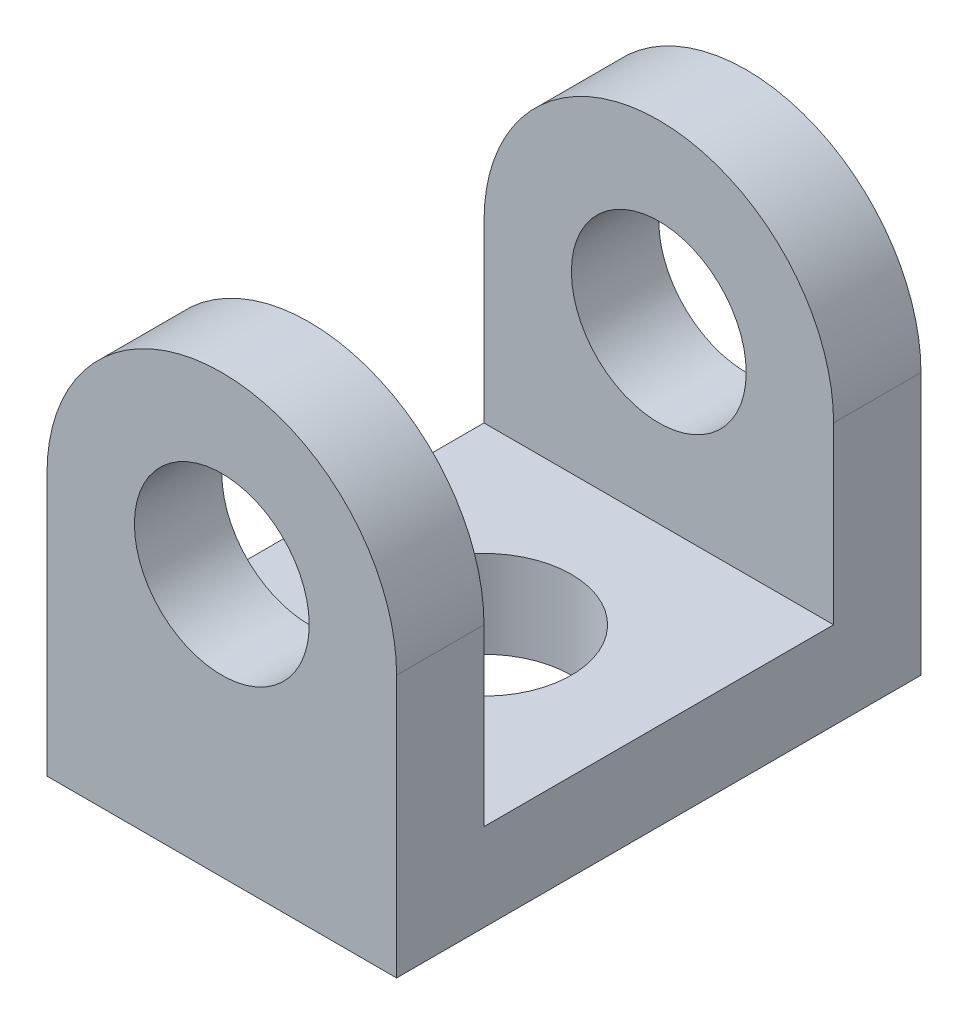
ISO-10303-21;
HEADER;
FILE_DESCRIPTION(('STEP AP214'),'2;1');
FILE_NAME('part.step','',(''),(''),'','','');
FILE_SCHEMA(('AUTOMOTIVE_DESIGN { 1 0 10303 214 1 1 1 1 }'));
ENDSEC;
DATA;
#1=APPLICATION_CONTEXT('core data for automotive mechanical design processes');
#2=APPLICATION_PROTOCOL_DEFINITION('international standard','automotive_design',2000,#1);
#3=PRODUCT_CONTEXT('',#1,'mechanical');
#4=PRODUCT('Part','Part','',(#3));
#5=PRODUCT_RELATED_PRODUCT_CATEGORY('part','',(#4));
#6=PRODUCT_DEFINITION_FORMATION('','',#4);
#7=PRODUCT_DEFINITION_CONTEXT('part definition',#1,'design');
#8=PRODUCT_DEFINITION('design','',#6,#7);
#9=PRODUCT_DEFINITION_SHAPE('','',#8);
#10=(LENGTH_UNIT() NAMED_UNIT(*) SI_UNIT(.MILLI.,.METRE.));
#11=(NAMED_UNIT(*) PLANE_ANGLE_UNIT() SI_UNIT($,.RADIAN.));
#12=(NAMED_UNIT(*) SI_UNIT($,.STERADIAN.) SOLID_ANGLE_UNIT());
#13=UNCERTAINTY_MEASURE_WITH_UNIT(LENGTH_MEASURE(1.E-05),#10,'distance_accuracy_value','');
#14=(GEOMETRIC_REPRESENTATION_CONTEXT(3) GLOBAL_UNCERTAINTY_ASSIGNED_CONTEXT((#13)) GLOBAL_UNIT_ASSIGNED_CONTEXT((#10,
#11,#12)) REPRESENTATION_CONTEXT('',''));
#15=CARTESIAN_POINT('',(0.,0.,0.));
#16=DIRECTION('',(0.,0.,1.));
#17=DIRECTION('',(1.,0.,0.));
#18=AXIS2_PLACEMENT_3D('',#15,#16,#17);
#19=CARTESIAN_POINT('',(0.,10.,30.));
#20=DIRECTION('',(0.,1.,0.));
#21=DIRECTION('',(0.,0.,1.));
#22=AXIS2_PLACEMENT_3D('',#19,#20,#21);
#23=PLANE('',#22);
#24=DIRECTION('',(1.,0.,0.));
#25=VECTOR('',#24,1.);
#26=CARTESIAN_POINT('',(0.,10.,50.));
#27=LINE('',#26,#25);
#28=CARTESIAN_POINT('',(0.,10.,50.));
#29=VERTEX_POINT('',#28);
#30=CARTESIAN_POINT('',(40.,10.,50.));
#31=VERTEX_POINT('',#30);
#32=EDGE_CURVE('E53',#29,#31,#27,.T.);
#33=ORIENTED_EDGE('',*,*,#32,.T.);
#34=DIRECTION('',(0.,0.,-1.));
#35=VECTOR('',#34,1.);
#36=CARTESIAN_POINT('',(40.,10.,30.));
#37=LINE('',#36,#35);
#38=CARTESIAN_POINT('',(40.,10.,10.));
#39=VERTEX_POINT('',#38);
#40=EDGE_CURVE('E161',#31,#39,#37,.T.);
#41=ORIENTED_EDGE('',*,*,#40,.T.);
#42=DIRECTION('',(1.,0.,0.));
#43=VECTOR('',#42,1.);
#44=CARTESIAN_POINT('',(0.,10.,10.));
#45=LINE('',#44,#43);
#46=CARTESIAN_POINT('',(0.,10.,9.99999999999999));
#47=VERTEX_POINT('',#46);
#48=EDGE_CURVE('E148',#47,#39,#45,.T.);
#49=ORIENTED_EDGE('',*,*,#48,.F.);
#50=DIRECTION('',(0.,0.,-1.));
#51=VECTOR('',#50,1.);
#52=CARTESIAN_POINT('',(0.,10.,30.));
#53=LINE('',#52,#51);
#54=EDGE_CURVE('E11',#29,#47,#53,.T.);
#55=ORIENTED_EDGE('',*,*,#54,.F.);
#56=EDGE_LOOP('',(#33,#41,#49,#55));
#57=FACE_BOUND('',#56,.T.);
#58=CARTESIAN_POINT('',(20.,10.,30.));
#59=DIRECTION('',(0.,1.,0.));
#60=DIRECTION('',(0.,0.,1.));
#61=AXIS2_PLACEMENT_3D('',#58,#59,#60);
#62=CIRCLE('',#61,10.);
#63=CARTESIAN_POINT('',(20.,10.,40.));
#64=VERTEX_POINT('',#63);
#65=EDGE_CURVE('E127',#64,#64,#62,.T.);
#66=ORIENTED_EDGE('',*,*,#65,.F.);
#67=EDGE_LOOP('',(#66));
#68=FACE_BOUND('',#67,.T.);
#69=ADVANCED_FACE('F35',(#57,#68),#23,.T.);
#70=CARTESIAN_POINT('',(0.,0.,30.));
#71=DIRECTION('',(0.,1.,0.));
#72=DIRECTION('',(0.,0.,1.));
#73=AXIS2_PLACEMENT_3D('',#70,#71,#72);
#74=PLANE('',#73);
#75=DIRECTION('',(1.,0.,0.));
#76=VECTOR('',#75,1.);
#77=CARTESIAN_POINT('',(0.,0.,0.));
#78=LINE('',#77,#76);
#79=CARTESIAN_POINT('',(0.,0.,0.));
#80=VERTEX_POINT('',#79);
#81=CARTESIAN_POINT('',(40.,0.,0.));
#82=VERTEX_POINT('',#81);
#83=EDGE_CURVE('E175',#80,#82,#78,.T.);
#84=ORIENTED_EDGE('',*,*,#83,.T.);
#85=DIRECTION('',(0.,0.,-1.));
#86=VECTOR('',#85,1.);
#87=CARTESIAN_POINT('',(40.,0.,30.));
#88=LINE('',#87,#86);
#89=CARTESIAN_POINT('',(40.,0.,60.));
#90=VERTEX_POINT('',#89);
#91=EDGE_CURVE('E163',#90,#82,#88,.T.);
#92=ORIENTED_EDGE('',*,*,#91,.F.);
#93=DIRECTION('',(1.,0.,0.));
#94=VECTOR('',#93,1.);
#95=CARTESIAN_POINT('',(0.,0.,60.));
#96=LINE('',#95,#94);
#97=CARTESIAN_POINT('',(0.,0.,60.));
#98=VERTEX_POINT('',#97);
#99=EDGE_CURVE('E131',#98,#90,#96,.T.);
#100=ORIENTED_EDGE('',*,*,#99,.F.);
#101=DIRECTION('',(0.,0.,-1.));
#102=VECTOR('',#101,1.);
#103=CARTESIAN_POINT('',(0.,0.,30.));
#104=LINE('',#103,#102);
#105=EDGE_CURVE('E43',#98,#80,#104,.T.);
#106=ORIENTED_EDGE('',*,*,#105,.T.);
#107=EDGE_LOOP('',(#84,#92,#100,#106));
#108=FACE_BOUND('',#107,.T.);
#109=CARTESIAN_POINT('',(20.,0.,30.));
#110=DIRECTION('',(0.,1.,0.));
#111=DIRECTION('',(0.,0.,1.));
#112=AXIS2_PLACEMENT_3D('',#109,#110,#111);
#113=CIRCLE('',#112,10.);
#114=CARTESIAN_POINT('',(20.,0.,40.));
#115=VERTEX_POINT('',#114);
#116=EDGE_CURVE('E218',#115,#115,#113,.T.);
#117=ORIENTED_EDGE('',*,*,#116,.T.);
#118=EDGE_LOOP('',(#117));
#119=FACE_BOUND('',#118,.T.);
#120=ADVANCED_FACE('F173',(#108,#119),#74,.F.);
#121=CARTESIAN_POINT('',(0.,0.,30.));
#122=DIRECTION('',(-1.,0.,0.));
#123=DIRECTION('',(0.,0.,1.));
#124=AXIS2_PLACEMENT_3D('',#121,#122,#123);
#125=PLANE('',#124);
#126=DIRECTION('',(0.,1.,0.));
#127=VECTOR('',#126,1.);
#128=CARTESIAN_POINT('',(0.,0.,0.));
#129=LINE('',#128,#127);
#130=CARTESIAN_POINT('',(0.,30.,0.));
#131=VERTEX_POINT('',#130);
#132=EDGE_CURVE('E181',#80,#131,#129,.T.);
#133=ORIENTED_EDGE('',*,*,#132,.F.);
#134=ORIENTED_EDGE('',*,*,#105,.F.);
#135=DIRECTION('',(0.,1.,0.));
#136=VECTOR('',#135,1.);
#137=CARTESIAN_POINT('',(0.,0.,60.));
#138=LINE('',#137,#136);
#139=CARTESIAN_POINT('',(0.,30.,60.));
#140=VERTEX_POINT('',#139);
#141=EDGE_CURVE('E109',#98,#140,#138,.T.);
#142=ORIENTED_EDGE('',*,*,#141,.T.);
#143=DIRECTION('',(0.,0.,1.));
#144=VECTOR('',#143,1.);
#145=CARTESIAN_POINT('',(0.,30.,50.));
#146=LINE('',#145,#144);
#147=CARTESIAN_POINT('',(0.,30.,50.));
#148=VERTEX_POINT('',#147);
#149=EDGE_CURVE('E105',#148,#140,#146,.T.);
#150=ORIENTED_EDGE('',*,*,#149,.F.);
#151=DIRECTION('',(0.,1.,0.));
#152=VECTOR('',#151,1.);
#153=CARTESIAN_POINT('',(0.,0.,50.));
#154=LINE('',#153,#152);
#155=EDGE_CURVE('E96',#29,#148,#154,.T.);
#156=ORIENTED_EDGE('',*,*,#155,.F.);
#157=ORIENTED_EDGE('',*,*,#54,.T.);
#158=DIRECTION('',(0.,1.,0.));
#159=VECTOR('',#158,1.);
#160=CARTESIAN_POINT('',(0.,0.,10.));
#161=LINE('',#160,#159);
#162=CARTESIAN_POINT('',(0.,30.,10.));
#163=VERTEX_POINT('',#162);
#164=EDGE_CURVE('E143',#47,#163,#161,.T.);
#165=ORIENTED_EDGE('',*,*,#164,.T.);
#166=DIRECTION('',(0.,0.,-1.));
#167=VECTOR('',#166,1.);
#168=CARTESIAN_POINT('',(0.,30.,10.));
#169=LINE('',#168,#167);
#170=EDGE_CURVE('E151',#163,#131,#169,.T.);
#171=ORIENTED_EDGE('',*,*,#170,.T.);
#172=EDGE_LOOP('',(#133,#134,#142,#150,#156,#157,#165,#171));
#173=FACE_BOUND('',#172,.T.);
#174=ADVANCED_FACE('F107',(#173),#125,.T.);
#175=CARTESIAN_POINT('',(40.,0.,30.));
#176=DIRECTION('',(-1.,0.,0.));
#177=DIRECTION('',(0.,0.,1.));
#178=AXIS2_PLACEMENT_3D('',#175,#176,#177);
#179=PLANE('',#178);
#180=DIRECTION('',(0.,1.,0.));
#181=VECTOR('',#180,1.);
#182=CARTESIAN_POINT('',(40.,0.,0.));
#183=LINE('',#182,#181);
#184=CARTESIAN_POINT('',(40.,30.,0.));
#185=VERTEX_POINT('',#184);
#186=EDGE_CURVE('E164',#82,#185,#183,.T.);
#187=ORIENTED_EDGE('',*,*,#186,.T.);
#188=DIRECTION('',(0.,0.,-1.));
#189=VECTOR('',#188,1.);
#190=CARTESIAN_POINT('',(40.,30.,10.));
#191=LINE('',#190,#189);
#192=CARTESIAN_POINT('',(40.,30.,10.));
#193=VERTEX_POINT('',#192);
#194=EDGE_CURVE('E185',#193,#185,#191,.T.);
#195=ORIENTED_EDGE('',*,*,#194,.F.);
#196=DIRECTION('',(0.,1.,0.));
#197=VECTOR('',#196,1.);
#198=CARTESIAN_POINT('',(40.,0.,10.));
#199=LINE('',#198,#197);
#200=EDGE_CURVE('E139',#39,#193,#199,.T.);
#201=ORIENTED_EDGE('',*,*,#200,.F.);
#202=ORIENTED_EDGE('',*,*,#40,.F.);
#203=DIRECTION('',(0.,1.,0.));
#204=VECTOR('',#203,1.);
#205=CARTESIAN_POINT('',(40.,0.,50.));
#206=LINE('',#205,#204);
#207=CARTESIAN_POINT('',(40.,30.,50.));
#208=VERTEX_POINT('',#207);
#209=EDGE_CURVE('E225',#31,#208,#206,.T.);
#210=ORIENTED_EDGE('',*,*,#209,.T.);
#211=DIRECTION('',(0.,0.,1.));
#212=VECTOR('',#211,1.);
#213=CARTESIAN_POINT('',(40.,30.,50.));
#214=LINE('',#213,#212);
#215=CARTESIAN_POINT('',(40.,30.,60.));
#216=VERTEX_POINT('',#215);
#217=EDGE_CURVE('E114',#208,#216,#214,.T.);
#218=ORIENTED_EDGE('',*,*,#217,.T.);
#219=DIRECTION('',(0.,1.,0.));
#220=VECTOR('',#219,1.);
#221=CARTESIAN_POINT('',(40.,0.,60.));
#222=LINE('',#221,#220);
#223=EDGE_CURVE('E113',#90,#216,#222,.T.);
#224=ORIENTED_EDGE('',*,*,#223,.F.);
#225=ORIENTED_EDGE('',*,*,#91,.T.);
#226=EDGE_LOOP('',(#187,#195,#201,#202,#210,#218,#224,#225));
#227=FACE_BOUND('',#226,.T.);
#228=ADVANCED_FACE('F227',(#227),#179,.F.);
#229=CARTESIAN_POINT('',(0.,0.,0.));
#230=DIRECTION('',(0.,0.,1.));
#231=DIRECTION('',(1.,0.,0.));
#232=AXIS2_PLACEMENT_3D('',#229,#230,#231);
#233=PLANE('',#232);
#234=ORIENTED_EDGE('',*,*,#132,.T.);
#235=CARTESIAN_POINT('',(20.,30.,0.));
#236=DIRECTION('',(0.,0.,1.));
#237=DIRECTION('',(1.,0.,0.));
#238=AXIS2_PLACEMENT_3D('',#235,#236,#237);
#239=CIRCLE('',#238,20.);
#240=EDGE_CURVE('E140',#185,#131,#239,.T.);
#241=ORIENTED_EDGE('',*,*,#240,.F.);
#242=ORIENTED_EDGE('',*,*,#186,.F.);
#243=ORIENTED_EDGE('',*,*,#83,.F.);
#244=EDGE_LOOP('',(#234,#241,#242,#243));
#245=FACE_BOUND('',#244,.T.);
#246=CARTESIAN_POINT('',(20.,30.,0.));
#247=DIRECTION('',(0.,0.,1.));
#248=DIRECTION('',(1.,0.,0.));
#249=AXIS2_PLACEMENT_3D('',#246,#247,#248);
#250=CIRCLE('',#249,10.);
#251=CARTESIAN_POINT('',(30.,30.,0.));
#252=VERTEX_POINT('',#251);
#253=EDGE_CURVE('E135',#252,#252,#250,.T.);
#254=ORIENTED_EDGE('',*,*,#253,.T.);
#255=EDGE_LOOP('',(#254));
#256=FACE_BOUND('',#255,.T.);
#257=ADVANCED_FACE('F178',(#245,#256),#233,.F.);
#258=CARTESIAN_POINT('',(20.,30.,10.));
#259=DIRECTION('',(0.,0.,-1.));
#260=DIRECTION('',(-1.,0.,0.));
#261=AXIS2_PLACEMENT_3D('',#258,#259,#260);
#262=CYLINDRICAL_SURFACE('',#261,20.);
#263=ORIENTED_EDGE('',*,*,#240,.T.);
#264=ORIENTED_EDGE('',*,*,#170,.F.);
#265=CARTESIAN_POINT('',(20.,30.,10.));
#266=DIRECTION('',(0.,0.,1.));
#267=DIRECTION('',(1.,0.,0.));
#268=AXIS2_PLACEMENT_3D('',#265,#266,#267);
#269=CIRCLE('',#268,20.);
#270=EDGE_CURVE('E141',#193,#163,#269,.T.);
#271=ORIENTED_EDGE('',*,*,#270,.F.);
#272=ORIENTED_EDGE('',*,*,#194,.T.);
#273=EDGE_LOOP('',(#263,#264,#271,#272));
#274=FACE_BOUND('',#273,.T.);
#275=ADVANCED_FACE('F197',(#274),#262,.T.);
#276=CARTESIAN_POINT('',(20.,30.,10.));
#277=DIRECTION('',(0.,0.,-1.));
#278=DIRECTION('',(-1.,0.,0.));
#279=AXIS2_PLACEMENT_3D('',#276,#277,#278);
#280=CYLINDRICAL_SURFACE('',#279,10.);
#281=CARTESIAN_POINT('',(20.,30.,10.));
#282=DIRECTION('',(0.,0.,1.));
#283=DIRECTION('',(1.,0.,0.));
#284=AXIS2_PLACEMENT_3D('',#281,#282,#283);
#285=CIRCLE('',#284,10.);
#286=CARTESIAN_POINT('',(30.,30.,10.));
#287=VERTEX_POINT('',#286);
#288=EDGE_CURVE('E136',#287,#287,#285,.T.);
#289=ORIENTED_EDGE('',*,*,#288,.T.);
#290=EDGE_LOOP('',(#289));
#291=FACE_BOUND('',#290,.T.);
#292=ORIENTED_EDGE('',*,*,#253,.F.);
#293=EDGE_LOOP('',(#292));
#294=FACE_BOUND('',#293,.T.);
#295=ADVANCED_FACE('F194',(#291,#294),#280,.F.);
#296=CARTESIAN_POINT('',(0.,0.,10.));
#297=DIRECTION('',(0.,0.,1.));
#298=DIRECTION('',(1.,0.,0.));
#299=AXIS2_PLACEMENT_3D('',#296,#297,#298);
#300=PLANE('',#299);
#301=ORIENTED_EDGE('',*,*,#288,.F.);
#302=EDGE_LOOP('',(#301));
#303=FACE_BOUND('',#302,.T.);
#304=ORIENTED_EDGE('',*,*,#200,.T.);
#305=ORIENTED_EDGE('',*,*,#270,.T.);
#306=ORIENTED_EDGE('',*,*,#164,.F.);
#307=ORIENTED_EDGE('',*,*,#48,.T.);
#308=EDGE_LOOP('',(#304,#305,#306,#307));
#309=FACE_BOUND('',#308,.T.);
#310=ADVANCED_FACE('F196',(#303,#309),#300,.T.);
#311=CARTESIAN_POINT('',(0.,0.,60.));
#312=DIRECTION('',(0.,0.,-1.));
#313=DIRECTION('',(1.,0.,0.));
#314=AXIS2_PLACEMENT_3D('',#311,#312,#313);
#315=PLANE('',#314);
#316=ORIENTED_EDGE('',*,*,#223,.T.);
#317=CARTESIAN_POINT('',(20.,30.,60.));
#318=DIRECTION('',(0.,0.,1.));
#319=DIRECTION('',(1.,0.,0.));
#320=AXIS2_PLACEMENT_3D('',#317,#318,#319);
#321=CIRCLE('',#320,20.);
#322=EDGE_CURVE('E126',#216,#140,#321,.T.);
#323=ORIENTED_EDGE('',*,*,#322,.T.);
#324=ORIENTED_EDGE('',*,*,#141,.F.);
#325=ORIENTED_EDGE('',*,*,#99,.T.);
#326=EDGE_LOOP('',(#316,#323,#324,#325));
#327=FACE_BOUND('',#326,.T.);
#328=CARTESIAN_POINT('',(20.,30.,60.));
#329=DIRECTION('',(0.,0.,1.));
#330=DIRECTION('',(1.,0.,0.));
#331=AXIS2_PLACEMENT_3D('',#328,#329,#330);
#332=CIRCLE('',#331,10.);
#333=CARTESIAN_POINT('',(30.,30.,60.));
#334=VERTEX_POINT('',#333);
#335=EDGE_CURVE('E123',#334,#334,#332,.T.);
#336=ORIENTED_EDGE('',*,*,#335,.F.);
#337=EDGE_LOOP('',(#336));
#338=FACE_BOUND('',#337,.T.);
#339=ADVANCED_FACE('F204',(#327,#338),#315,.F.);
#340=CARTESIAN_POINT('',(20.,30.,50.));
#341=DIRECTION('',(0.,0.,1.));
#342=DIRECTION('',(1.,0.,0.));
#343=AXIS2_PLACEMENT_3D('',#340,#341,#342);
#344=CYLINDRICAL_SURFACE('',#343,10.);
#345=CARTESIAN_POINT('',(20.,30.,50.));
#346=DIRECTION('',(0.,0.,1.));
#347=DIRECTION('',(1.,0.,0.));
#348=AXIS2_PLACEMENT_3D('',#345,#346,#347);
#349=CIRCLE('',#348,10.);
#350=CARTESIAN_POINT('',(30.,30.,50.));
#351=VERTEX_POINT('',#350);
#352=EDGE_CURVE('E128',#351,#351,#349,.T.);
#353=ORIENTED_EDGE('',*,*,#352,.F.);
#354=EDGE_LOOP('',(#353));
#355=FACE_BOUND('',#354,.T.);
#356=ORIENTED_EDGE('',*,*,#335,.T.);
#357=EDGE_LOOP('',(#356));
#358=FACE_BOUND('',#357,.T.);
#359=ADVANCED_FACE('F236',(#355,#358),#344,.F.);
#360=CARTESIAN_POINT('',(20.,30.,50.));
#361=DIRECTION('',(0.,0.,1.));
#362=DIRECTION('',(1.,0.,0.));
#363=AXIS2_PLACEMENT_3D('',#360,#361,#362);
#364=CYLINDRICAL_SURFACE('',#363,20.);
#365=ORIENTED_EDGE('',*,*,#322,.F.);
#366=ORIENTED_EDGE('',*,*,#217,.F.);
#367=CARTESIAN_POINT('',(20.,30.,50.));
#368=DIRECTION('',(0.,0.,1.));
#369=DIRECTION('',(1.,0.,0.));
#370=AXIS2_PLACEMENT_3D('',#367,#368,#369);
#371=CIRCLE('',#370,20.);
#372=EDGE_CURVE('E101',#208,#148,#371,.T.);
#373=ORIENTED_EDGE('',*,*,#372,.T.);
#374=ORIENTED_EDGE('',*,*,#149,.T.);
#375=EDGE_LOOP('',(#365,#366,#373,#374));
#376=FACE_BOUND('',#375,.T.);
#377=ADVANCED_FACE('F116',(#376),#364,.T.);
#378=CARTESIAN_POINT('',(0.,0.,50.));
#379=DIRECTION('',(0.,0.,-1.));
#380=DIRECTION('',(1.,0.,0.));
#381=AXIS2_PLACEMENT_3D('',#378,#379,#380);
#382=PLANE('',#381);
#383=ORIENTED_EDGE('',*,*,#352,.T.);
#384=EDGE_LOOP('',(#383));
#385=FACE_BOUND('',#384,.T.);
#386=ORIENTED_EDGE('',*,*,#209,.F.);
#387=ORIENTED_EDGE('',*,*,#32,.F.);
#388=ORIENTED_EDGE('',*,*,#155,.T.);
#389=ORIENTED_EDGE('',*,*,#372,.F.);
#390=EDGE_LOOP('',(#386,#387,#388,#389));
#391=FACE_BOUND('',#390,.T.);
#392=ADVANCED_FACE('F99',(#385,#391),#382,.T.);
#393=CARTESIAN_POINT('',(20.,10.,30.));
#394=DIRECTION('',(0.,-1.,0.));
#395=DIRECTION('',(0.,0.,-1.));
#396=AXIS2_PLACEMENT_3D('',#393,#394,#395);
#397=CYLINDRICAL_SURFACE('',#396,10.);
#398=ORIENTED_EDGE('',*,*,#65,.T.);
#399=EDGE_LOOP('',(#398));
#400=FACE_BOUND('',#399,.T.);
#401=ORIENTED_EDGE('',*,*,#116,.F.);
#402=EDGE_LOOP('',(#401));
#403=FACE_BOUND('',#402,.T.);
#404=ADVANCED_FACE('F251',(#400,#403),#397,.F.);
#405=CLOSED_SHELL('',(#69,#120,#174,#228,#257,#275,#295,#310,#339,#359,#377,#392,#404));
#406=MANIFOLD_SOLID_BREP('B2',#405);
#407=ADVANCED_BREP_SHAPE_REPRESENTATION('',(#18,#406),#14);
#408=SHAPE_DEFINITION_REPRESENTATION(#9,#407);
ENDSEC;
END-ISO-10303-21;
